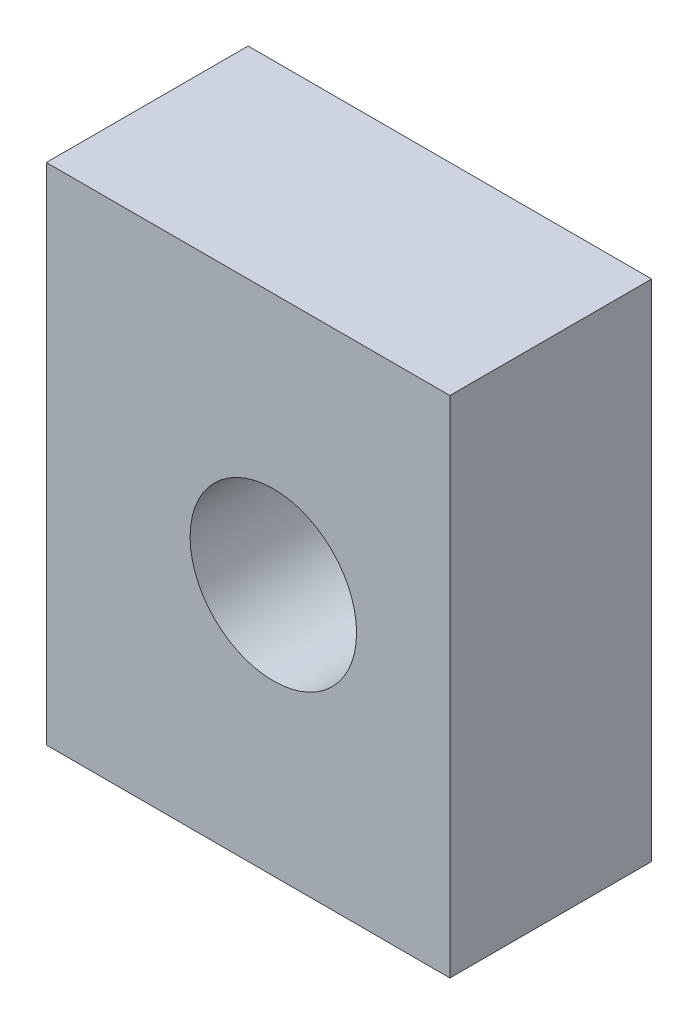
ISO-10303-21;
HEADER;
FILE_DESCRIPTION(('STEP AP214'),'2;1');
FILE_NAME('part.step','',(''),(''),'','','');
FILE_SCHEMA(('AUTOMOTIVE_DESIGN { 1 0 10303 214 1 1 1 1 }'));
ENDSEC;
DATA;
#1=APPLICATION_CONTEXT('core data for automotive mechanical design processes');
#2=APPLICATION_PROTOCOL_DEFINITION('international standard','automotive_design',2000,#1);
#3=PRODUCT_CONTEXT('',#1,'mechanical');
#4=PRODUCT('Part','Part','',(#3));
#5=PRODUCT_RELATED_PRODUCT_CATEGORY('part','',(#4));
#6=PRODUCT_DEFINITION_FORMATION('','',#4);
#7=PRODUCT_DEFINITION_CONTEXT('part definition',#1,'design');
#8=PRODUCT_DEFINITION('design','',#6,#7);
#9=PRODUCT_DEFINITION_SHAPE('','',#8);
#10=(LENGTH_UNIT() NAMED_UNIT(*) SI_UNIT(.MILLI.,.METRE.));
#11=(NAMED_UNIT(*) PLANE_ANGLE_UNIT() SI_UNIT($,.RADIAN.));
#12=(NAMED_UNIT(*) SI_UNIT($,.STERADIAN.) SOLID_ANGLE_UNIT());
#13=UNCERTAINTY_MEASURE_WITH_UNIT(LENGTH_MEASURE(1.E-05),#10,'distance_accuracy_value','');
#14=(GEOMETRIC_REPRESENTATION_CONTEXT(3) GLOBAL_UNCERTAINTY_ASSIGNED_CONTEXT((#13)) GLOBAL_UNIT_ASSIGNED_CONTEXT((#10,
#11,#12)) REPRESENTATION_CONTEXT('',''));
#15=CARTESIAN_POINT('',(0.,0.,0.));
#16=DIRECTION('',(0.,0.,1.));
#17=DIRECTION('',(1.,0.,0.));
#18=AXIS2_PLACEMENT_3D('',#15,#16,#17);
#19=CARTESIAN_POINT('',(0.,0.,4.));
#20=DIRECTION('',(0.,0.,-1.));
#21=DIRECTION('',(-1.,0.,0.));
#22=AXIS2_PLACEMENT_3D('',#19,#20,#21);
#23=PLANE('',#22);
#24=DIRECTION('',(0.,1.,0.));
#25=VECTOR('',#24,1.);
#26=CARTESIAN_POINT('',(7.99999999999996,10.,4.));
#27=LINE('',#26,#25);
#28=CARTESIAN_POINT('',(7.99999999999996,0.,4.));
#29=VERTEX_POINT('',#28);
#30=CARTESIAN_POINT('',(7.99999999999996,10.,4.));
#31=VERTEX_POINT('',#30);
#32=EDGE_CURVE('E85',#29,#31,#27,.T.);
#33=ORIENTED_EDGE('',*,*,#32,.T.);
#34=DIRECTION('',(-1.,0.,0.));
#35=VECTOR('',#34,1.);
#36=CARTESIAN_POINT('',(0.,10.,4.));
#37=LINE('',#36,#35);
#38=CARTESIAN_POINT('',(0.,10.,4.));
#39=VERTEX_POINT('',#38);
#40=EDGE_CURVE('E80',#31,#39,#37,.T.);
#41=ORIENTED_EDGE('',*,*,#40,.T.);
#42=DIRECTION('',(0.,-1.,0.));
#43=VECTOR('',#42,1.);
#44=CARTESIAN_POINT('',(0.,10.,4.));
#45=LINE('',#44,#43);
#46=CARTESIAN_POINT('',(0.,0.,4.));
#47=VERTEX_POINT('',#46);
#48=EDGE_CURVE('E83',#39,#47,#45,.T.);
#49=ORIENTED_EDGE('',*,*,#48,.T.);
#50=DIRECTION('',(1.,0.,0.));
#51=VECTOR('',#50,1.);
#52=CARTESIAN_POINT('',(7.99999999999996,0.,4.));
#53=LINE('',#52,#51);
#54=EDGE_CURVE('E50',#47,#29,#53,.T.);
#55=ORIENTED_EDGE('',*,*,#54,.T.);
#56=EDGE_LOOP('',(#33,#41,#49,#55));
#57=FACE_BOUND('',#56,.T.);
#58=CARTESIAN_POINT('',(4.49999999999998,5.,4.));
#59=DIRECTION('',(0.,0.,1.));
#60=DIRECTION('',(1.,0.,0.));
#61=AXIS2_PLACEMENT_3D('',#58,#59,#60);
#62=CIRCLE('',#61,1.65);
#63=CARTESIAN_POINT('',(6.14999999999998,5.,4.));
#64=VERTEX_POINT('',#63);
#65=EDGE_CURVE('E100',#64,#64,#62,.T.);
#66=ORIENTED_EDGE('',*,*,#65,.F.);
#67=EDGE_LOOP('',(#66));
#68=FACE_BOUND('',#67,.T.);
#69=ADVANCED_FACE('F33',(#57,#68),#23,.F.);
#70=CARTESIAN_POINT('',(0.,0.,0.));
#71=DIRECTION('',(0.,0.,-1.));
#72=DIRECTION('',(-1.,0.,0.));
#73=AXIS2_PLACEMENT_3D('',#70,#71,#72);
#74=PLANE('',#73);
#75=DIRECTION('',(0.,1.,0.));
#76=VECTOR('',#75,1.);
#77=CARTESIAN_POINT('',(7.99999999999996,10.,0.));
#78=LINE('',#77,#76);
#79=CARTESIAN_POINT('',(7.99999999999996,0.,0.));
#80=VERTEX_POINT('',#79);
#81=CARTESIAN_POINT('',(7.99999999999996,10.,0.));
#82=VERTEX_POINT('',#81);
#83=EDGE_CURVE('E97',#80,#82,#78,.T.);
#84=ORIENTED_EDGE('',*,*,#83,.F.);
#85=DIRECTION('',(1.,0.,0.));
#86=VECTOR('',#85,1.);
#87=CARTESIAN_POINT('',(7.99999999999996,0.,0.));
#88=LINE('',#87,#86);
#89=CARTESIAN_POINT('',(0.,0.,0.));
#90=VERTEX_POINT('',#89);
#91=EDGE_CURVE('E73',#90,#80,#88,.T.);
#92=ORIENTED_EDGE('',*,*,#91,.F.);
#93=DIRECTION('',(0.,-1.,0.));
#94=VECTOR('',#93,1.);
#95=CARTESIAN_POINT('',(0.,10.,0.));
#96=LINE('',#95,#94);
#97=CARTESIAN_POINT('',(0.,10.,0.));
#98=VERTEX_POINT('',#97);
#99=EDGE_CURVE('E67',#98,#90,#96,.T.);
#100=ORIENTED_EDGE('',*,*,#99,.F.);
#101=DIRECTION('',(-1.,0.,0.));
#102=VECTOR('',#101,1.);
#103=CARTESIAN_POINT('',(0.,10.,0.));
#104=LINE('',#103,#102);
#105=EDGE_CURVE('E89',#82,#98,#104,.T.);
#106=ORIENTED_EDGE('',*,*,#105,.F.);
#107=EDGE_LOOP('',(#84,#92,#100,#106));
#108=FACE_BOUND('',#107,.T.);
#109=CARTESIAN_POINT('',(4.49999999999998,5.,0.));
#110=DIRECTION('',(0.,0.,1.));
#111=DIRECTION('',(1.,0.,0.));
#112=AXIS2_PLACEMENT_3D('',#109,#110,#111);
#113=CIRCLE('',#112,1.65);
#114=CARTESIAN_POINT('',(6.14999999999998,5.,0.));
#115=VERTEX_POINT('',#114);
#116=EDGE_CURVE('E112',#115,#115,#113,.T.);
#117=ORIENTED_EDGE('',*,*,#116,.T.);
#118=EDGE_LOOP('',(#117));
#119=FACE_BOUND('',#118,.T.);
#120=ADVANCED_FACE('F108',(#108,#119),#74,.T.);
#121=CARTESIAN_POINT('',(7.99999999999996,10.,4.));
#122=DIRECTION('',(-1.,0.,0.));
#123=DIRECTION('',(0.,0.,1.));
#124=AXIS2_PLACEMENT_3D('',#121,#122,#123);
#125=PLANE('',#124);
#126=ORIENTED_EDGE('',*,*,#83,.T.);
#127=DIRECTION('',(0.,0.,-1.));
#128=VECTOR('',#127,1.);
#129=CARTESIAN_POINT('',(7.99999999999996,10.,4.));
#130=LINE('',#129,#128);
#131=EDGE_CURVE('E11',#31,#82,#130,.T.);
#132=ORIENTED_EDGE('',*,*,#131,.F.);
#133=ORIENTED_EDGE('',*,*,#32,.F.);
#134=DIRECTION('',(0.,0.,-1.));
#135=VECTOR('',#134,1.);
#136=CARTESIAN_POINT('',(7.99999999999996,0.,4.));
#137=LINE('',#136,#135);
#138=EDGE_CURVE('E93',#29,#80,#137,.T.);
#139=ORIENTED_EDGE('',*,*,#138,.T.);
#140=EDGE_LOOP('',(#126,#132,#133,#139));
#141=FACE_BOUND('',#140,.T.);
#142=ADVANCED_FACE('F35',(#141),#125,.F.);
#143=CARTESIAN_POINT('',(0.,10.,4.));
#144=DIRECTION('',(0.,-1.,0.));
#145=DIRECTION('',(1.,0.,0.));
#146=AXIS2_PLACEMENT_3D('',#143,#144,#145);
#147=PLANE('',#146);
#148=ORIENTED_EDGE('',*,*,#105,.T.);
#149=DIRECTION('',(0.,0.,-1.));
#150=VECTOR('',#149,1.);
#151=CARTESIAN_POINT('',(0.,10.,4.));
#152=LINE('',#151,#150);
#153=EDGE_CURVE('E42',#39,#98,#152,.T.);
#154=ORIENTED_EDGE('',*,*,#153,.F.);
#155=ORIENTED_EDGE('',*,*,#40,.F.);
#156=ORIENTED_EDGE('',*,*,#131,.T.);
#157=EDGE_LOOP('',(#148,#154,#155,#156));
#158=FACE_BOUND('',#157,.T.);
#159=ADVANCED_FACE('F88',(#158),#147,.F.);
#160=CARTESIAN_POINT('',(0.,10.,4.));
#161=DIRECTION('',(1.,0.,0.));
#162=DIRECTION('',(0.,1.,0.));
#163=AXIS2_PLACEMENT_3D('',#160,#161,#162);
#164=PLANE('',#163);
#165=ORIENTED_EDGE('',*,*,#99,.T.);
#166=DIRECTION('',(0.,0.,-1.));
#167=VECTOR('',#166,1.);
#168=CARTESIAN_POINT('',(0.,0.,4.));
#169=LINE('',#168,#167);
#170=EDGE_CURVE('E90',#47,#90,#169,.T.);
#171=ORIENTED_EDGE('',*,*,#170,.F.);
#172=ORIENTED_EDGE('',*,*,#48,.F.);
#173=ORIENTED_EDGE('',*,*,#153,.T.);
#174=EDGE_LOOP('',(#165,#171,#172,#173));
#175=FACE_BOUND('',#174,.T.);
#176=ADVANCED_FACE('F91',(#175),#164,.F.);
#177=CARTESIAN_POINT('',(7.99999999999996,0.,4.));
#178=DIRECTION('',(0.,1.,0.));
#179=DIRECTION('',(-1.,0.,0.));
#180=AXIS2_PLACEMENT_3D('',#177,#178,#179);
#181=PLANE('',#180);
#182=ORIENTED_EDGE('',*,*,#91,.T.);
#183=ORIENTED_EDGE('',*,*,#138,.F.);
#184=ORIENTED_EDGE('',*,*,#54,.F.);
#185=ORIENTED_EDGE('',*,*,#170,.T.);
#186=EDGE_LOOP('',(#182,#183,#184,#185));
#187=FACE_BOUND('',#186,.T.);
#188=ADVANCED_FACE('F105',(#187),#181,.F.);
#189=CARTESIAN_POINT('',(4.49999999999998,5.,4.));
#190=DIRECTION('',(0.,0.,-1.));
#191=DIRECTION('',(-1.,0.,0.));
#192=AXIS2_PLACEMENT_3D('',#189,#190,#191);
#193=CYLINDRICAL_SURFACE('',#192,1.65);
#194=ORIENTED_EDGE('',*,*,#65,.T.);
#195=EDGE_LOOP('',(#194));
#196=FACE_BOUND('',#195,.T.);
#197=ORIENTED_EDGE('',*,*,#116,.F.);
#198=EDGE_LOOP('',(#197));
#199=FACE_BOUND('',#198,.T.);
#200=ADVANCED_FACE('F118',(#196,#199),#193,.F.);
#201=CLOSED_SHELL('',(#69,#120,#142,#159,#176,#188,#200));
#202=MANIFOLD_SOLID_BREP('B2',#201);
#203=ADVANCED_BREP_SHAPE_REPRESENTATION('',(#18,#202),#14);
#204=SHAPE_DEFINITION_REPRESENTATION(#9,#203);
ENDSEC;
END-ISO-10303-21;
